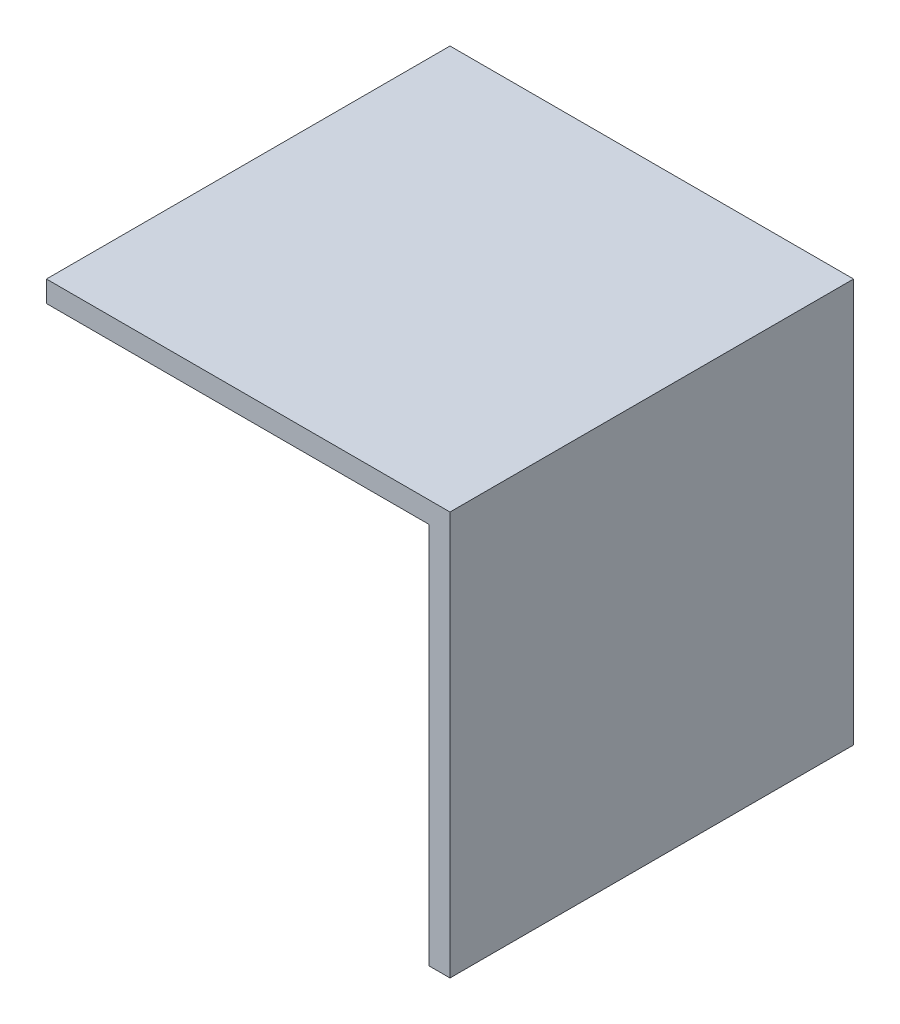
ISO-10303-21;
HEADER;
FILE_DESCRIPTION(('STEP AP214'),'2;1');
FILE_NAME('part.step','',(''),(''),'','','');
FILE_SCHEMA(('AUTOMOTIVE_DESIGN { 1 0 10303 214 1 1 1 1 }'));
ENDSEC;
DATA;
#1=APPLICATION_CONTEXT('core data for automotive mechanical design processes');
#2=APPLICATION_PROTOCOL_DEFINITION('international standard','automotive_design',2000,#1);
#3=PRODUCT_CONTEXT('',#1,'mechanical');
#4=PRODUCT('Part','Part','',(#3));
#5=PRODUCT_RELATED_PRODUCT_CATEGORY('part','',(#4));
#6=PRODUCT_DEFINITION_FORMATION('','',#4);
#7=PRODUCT_DEFINITION_CONTEXT('part definition',#1,'design');
#8=PRODUCT_DEFINITION('design','',#6,#7);
#9=PRODUCT_DEFINITION_SHAPE('','',#8);
#10=(LENGTH_UNIT() NAMED_UNIT(*) SI_UNIT(.MILLI.,.METRE.));
#11=(NAMED_UNIT(*) PLANE_ANGLE_UNIT() SI_UNIT($,.RADIAN.));
#12=(NAMED_UNIT(*) SI_UNIT($,.STERADIAN.) SOLID_ANGLE_UNIT());
#13=UNCERTAINTY_MEASURE_WITH_UNIT(LENGTH_MEASURE(1.E-05),#10,'distance_accuracy_value','');
#14=(GEOMETRIC_REPRESENTATION_CONTEXT(3) GLOBAL_UNCERTAINTY_ASSIGNED_CONTEXT((#13)) GLOBAL_UNIT_ASSIGNED_CONTEXT((#10,
#11,#12)) REPRESENTATION_CONTEXT('',''));
#15=CARTESIAN_POINT('',(0.,0.,0.));
#16=DIRECTION('',(0.,0.,1.));
#17=DIRECTION('',(1.,0.,0.));
#18=AXIS2_PLACEMENT_3D('',#15,#16,#17);
#19=CARTESIAN_POINT('',(0.,0.,5.));
#20=DIRECTION('',(0.,0.,-1.));
#21=DIRECTION('',(-1.,0.,0.));
#22=AXIS2_PLACEMENT_3D('',#19,#20,#21);
#23=PLANE('',#22);
#24=CARTESIAN_POINT('',(0.,19.5,5.));
#25=DIRECTION('',(0.,0.,-1.));
#26=DIRECTION('',(-1.,0.,0.));
#27=AXIS2_PLACEMENT_3D('',#24,#25,#26);
#28=CIRCLE('',#27,13.25);
#29=CARTESIAN_POINT('',(-13.25,19.5,5.));
#30=VERTEX_POINT('',#29);
#31=EDGE_CURVE('E148',#30,#30,#28,.T.);
#32=ORIENTED_EDGE('',*,*,#31,.T.);
#33=EDGE_LOOP('',(#32));
#34=FACE_BOUND('',#33,.T.);
#35=DIRECTION('',(0.,-1.,0.));
#36=VECTOR('',#35,1.);
#37=CARTESIAN_POINT('',(-45.,0.,5.));
#38=LINE('',#37,#36);
#39=CARTESIAN_POINT('',(-45.,45.,5.));
#40=VERTEX_POINT('',#39);
#41=CARTESIAN_POINT('',(-45.,-45.,5.));
#42=VERTEX_POINT('',#41);
#43=EDGE_CURVE('E125',#40,#42,#38,.T.);
#44=ORIENTED_EDGE('',*,*,#43,.T.);
#45=DIRECTION('',(1.,0.,0.));
#46=VECTOR('',#45,1.);
#47=CARTESIAN_POINT('',(0.,-45.,5.));
#48=LINE('',#47,#46);
#49=CARTESIAN_POINT('',(45.,-45.,5.));
#50=VERTEX_POINT('',#49);
#51=EDGE_CURVE('E140',#42,#50,#48,.T.);
#52=ORIENTED_EDGE('',*,*,#51,.T.);
#53=DIRECTION('',(0.,-1.,0.));
#54=VECTOR('',#53,1.);
#55=CARTESIAN_POINT('',(45.,45.,5.));
#56=LINE('',#55,#54);
#57=CARTESIAN_POINT('',(45.,45.,5.));
#58=VERTEX_POINT('',#57);
#59=EDGE_CURVE('E156',#58,#50,#56,.T.);
#60=ORIENTED_EDGE('',*,*,#59,.F.);
#61=DIRECTION('',(1.,0.,0.));
#62=VECTOR('',#61,1.);
#63=CARTESIAN_POINT('',(-50.,45.,5.));
#64=LINE('',#63,#62);
#65=EDGE_CURVE('E152',#40,#58,#64,.T.);
#66=ORIENTED_EDGE('',*,*,#65,.F.);
#67=EDGE_LOOP('',(#44,#52,#60,#66));
#68=FACE_BOUND('',#67,.T.);
#69=ADVANCED_FACE('F42',(#34,#68),#23,.F.);
#70=CARTESIAN_POINT('',(50.,-50.,5.));
#71=DIRECTION('',(-1.,0.,0.));
#72=DIRECTION('',(0.,0.,1.));
#73=AXIS2_PLACEMENT_3D('',#70,#71,#72);
#74=PLANE('',#73);
#75=DIRECTION('',(0.,0.,-1.));
#76=VECTOR('',#75,1.);
#77=CARTESIAN_POINT('',(50.,50.,5.));
#78=LINE('',#77,#76);
#79=CARTESIAN_POINT('',(50.,50.,95.));
#80=VERTEX_POINT('',#79);
#81=CARTESIAN_POINT('',(50.,50.,0.));
#82=VERTEX_POINT('',#81);
#83=EDGE_CURVE('E51',#80,#82,#78,.T.);
#84=ORIENTED_EDGE('',*,*,#83,.F.);
#85=DIRECTION('',(0.,1.,0.));
#86=VECTOR('',#85,1.);
#87=CARTESIAN_POINT('',(50.,50.,95.));
#88=LINE('',#87,#86);
#89=CARTESIAN_POINT('',(50.,-45.,95.));
#90=VERTEX_POINT('',#89);
#91=EDGE_CURVE('E102',#90,#80,#88,.T.);
#92=ORIENTED_EDGE('',*,*,#91,.F.);
#93=DIRECTION('',(0.,0.,-1.));
#94=VECTOR('',#93,1.);
#95=CARTESIAN_POINT('',(50.,-45.,100.));
#96=LINE('',#95,#94);
#97=CARTESIAN_POINT('',(50.,-45.,0.));
#98=VERTEX_POINT('',#97);
#99=EDGE_CURVE('E111',#90,#98,#96,.T.);
#100=ORIENTED_EDGE('',*,*,#99,.T.);
#101=DIRECTION('',(0.,1.,0.));
#102=VECTOR('',#101,1.);
#103=CARTESIAN_POINT('',(50.,-50.,0.));
#104=LINE('',#103,#102);
#105=EDGE_CURVE('E163',#98,#82,#104,.T.);
#106=ORIENTED_EDGE('',*,*,#105,.T.);
#107=EDGE_LOOP('',(#84,#92,#100,#106));
#108=FACE_BOUND('',#107,.T.);
#109=ADVANCED_FACE('F44',(#108),#74,.F.);
#110=CARTESIAN_POINT('',(-50.,50.,5.));
#111=DIRECTION('',(0.,-1.,0.));
#112=DIRECTION('',(0.,0.,-1.));
#113=AXIS2_PLACEMENT_3D('',#110,#111,#112);
#114=PLANE('',#113);
#115=DIRECTION('',(0.,0.,-1.));
#116=VECTOR('',#115,1.);
#117=CARTESIAN_POINT('',(-45.,50.,100.));
#118=LINE('',#117,#116);
#119=CARTESIAN_POINT('',(-45.,50.,95.));
#120=VERTEX_POINT('',#119);
#121=CARTESIAN_POINT('',(-45.,50.,0.));
#122=VERTEX_POINT('',#121);
#123=EDGE_CURVE('E127',#120,#122,#118,.T.);
#124=ORIENTED_EDGE('',*,*,#123,.F.);
#125=DIRECTION('',(1.,0.,0.));
#126=VECTOR('',#125,1.);
#127=CARTESIAN_POINT('',(-45.,50.,95.));
#128=LINE('',#127,#126);
#129=EDGE_CURVE('E58',#120,#80,#128,.T.);
#130=ORIENTED_EDGE('',*,*,#129,.T.);
#131=ORIENTED_EDGE('',*,*,#83,.T.);
#132=DIRECTION('',(-1.,0.,0.));
#133=VECTOR('',#132,1.);
#134=CARTESIAN_POINT('',(-50.,50.,0.));
#135=LINE('',#134,#133);
#136=EDGE_CURVE('E166',#82,#122,#135,.T.);
#137=ORIENTED_EDGE('',*,*,#136,.T.);
#138=EDGE_LOOP('',(#124,#130,#131,#137));
#139=FACE_BOUND('',#138,.T.);
#140=ADVANCED_FACE('F171',(#139),#114,.F.);
#141=CARTESIAN_POINT('',(0.,0.,0.));
#142=DIRECTION('',(0.,0.,-1.));
#143=DIRECTION('',(-1.,0.,0.));
#144=AXIS2_PLACEMENT_3D('',#141,#142,#143);
#145=PLANE('',#144);
#146=DIRECTION('',(1.,0.,0.));
#147=VECTOR('',#146,1.);
#148=CARTESIAN_POINT('',(50.,-45.,0.));
#149=LINE('',#148,#147);
#150=CARTESIAN_POINT('',(-45.,-45.,0.));
#151=VERTEX_POINT('',#150);
#152=EDGE_CURVE('E117',#151,#98,#149,.T.);
#153=ORIENTED_EDGE('',*,*,#152,.F.);
#154=DIRECTION('',(0.,-1.,0.));
#155=VECTOR('',#154,1.);
#156=CARTESIAN_POINT('',(-45.,-45.,0.));
#157=LINE('',#156,#155);
#158=EDGE_CURVE('E177',#122,#151,#157,.T.);
#159=ORIENTED_EDGE('',*,*,#158,.F.);
#160=ORIENTED_EDGE('',*,*,#136,.F.);
#161=ORIENTED_EDGE('',*,*,#105,.F.);
#162=EDGE_LOOP('',(#153,#159,#160,#161));
#163=FACE_BOUND('',#162,.T.);
#164=CARTESIAN_POINT('',(0.,19.5,0.));
#165=DIRECTION('',(0.,0.,-1.));
#166=DIRECTION('',(-1.,0.,0.));
#167=AXIS2_PLACEMENT_3D('',#164,#165,#166);
#168=CIRCLE('',#167,13.25);
#169=CARTESIAN_POINT('',(-13.25,19.5,0.));
#170=VERTEX_POINT('',#169);
#171=EDGE_CURVE('E144',#170,#170,#168,.T.);
#172=ORIENTED_EDGE('',*,*,#171,.F.);
#173=EDGE_LOOP('',(#172));
#174=FACE_BOUND('',#173,.T.);
#175=ADVANCED_FACE('F174',(#163,#174),#145,.T.);
#176=CARTESIAN_POINT('',(-50.,45.,100.));
#177=DIRECTION('',(0.,1.,0.));
#178=DIRECTION('',(0.,0.,1.));
#179=AXIS2_PLACEMENT_3D('',#176,#177,#178);
#180=PLANE('',#179);
#181=DIRECTION('',(0.,0.,-1.));
#182=VECTOR('',#181,1.);
#183=CARTESIAN_POINT('',(45.,45.,100.));
#184=LINE('',#183,#182);
#185=CARTESIAN_POINT('',(45.,45.,95.));
#186=VERTEX_POINT('',#185);
#187=EDGE_CURVE('E160',#186,#58,#184,.T.);
#188=ORIENTED_EDGE('',*,*,#187,.F.);
#189=DIRECTION('',(-1.,0.,0.));
#190=VECTOR('',#189,1.);
#191=CARTESIAN_POINT('',(-50.,45.,95.));
#192=LINE('',#191,#190);
#193=CARTESIAN_POINT('',(-45.,45.,95.));
#194=VERTEX_POINT('',#193);
#195=EDGE_CURVE('E181',#186,#194,#192,.T.);
#196=ORIENTED_EDGE('',*,*,#195,.T.);
#197=DIRECTION('',(0.,0.,-1.));
#198=VECTOR('',#197,1.);
#199=CARTESIAN_POINT('',(-45.,45.,100.));
#200=LINE('',#199,#198);
#201=EDGE_CURVE('E120',#194,#40,#200,.T.);
#202=ORIENTED_EDGE('',*,*,#201,.T.);
#203=ORIENTED_EDGE('',*,*,#65,.T.);
#204=EDGE_LOOP('',(#188,#196,#202,#203));
#205=FACE_BOUND('',#204,.T.);
#206=ADVANCED_FACE('F194',(#205),#180,.F.);
#207=CARTESIAN_POINT('',(45.,45.,100.));
#208=DIRECTION('',(1.,0.,0.));
#209=DIRECTION('',(0.,1.,0.));
#210=AXIS2_PLACEMENT_3D('',#207,#208,#209);
#211=PLANE('',#210);
#212=DIRECTION('',(0.,0.,1.));
#213=VECTOR('',#212,1.);
#214=CARTESIAN_POINT('',(45.,-45.,100.));
#215=LINE('',#214,#213);
#216=CARTESIAN_POINT('',(45.,-45.,95.));
#217=VERTEX_POINT('',#216);
#218=EDGE_CURVE('E137',#50,#217,#215,.T.);
#219=ORIENTED_EDGE('',*,*,#218,.T.);
#220=DIRECTION('',(0.,1.,0.));
#221=VECTOR('',#220,1.);
#222=CARTESIAN_POINT('',(45.,45.,95.));
#223=LINE('',#222,#221);
#224=EDGE_CURVE('E104',#217,#186,#223,.T.);
#225=ORIENTED_EDGE('',*,*,#224,.T.);
#226=ORIENTED_EDGE('',*,*,#187,.T.);
#227=ORIENTED_EDGE('',*,*,#59,.T.);
#228=EDGE_LOOP('',(#219,#225,#226,#227));
#229=FACE_BOUND('',#228,.T.);
#230=ADVANCED_FACE('F192',(#229),#211,.F.);
#231=CARTESIAN_POINT('',(0.,19.5,95.));
#232=DIRECTION('',(0.,0.,-1.));
#233=DIRECTION('',(-1.,0.,0.));
#234=AXIS2_PLACEMENT_3D('',#231,#232,#233);
#235=CYLINDRICAL_SURFACE('',#234,13.25);
#236=ORIENTED_EDGE('',*,*,#171,.T.);
#237=EDGE_LOOP('',(#236));
#238=FACE_BOUND('',#237,.T.);
#239=ORIENTED_EDGE('',*,*,#31,.F.);
#240=EDGE_LOOP('',(#239));
#241=FACE_BOUND('',#240,.T.);
#242=ADVANCED_FACE('F208',(#238,#241),#235,.F.);
#243=CARTESIAN_POINT('',(50.,-45.,100.));
#244=DIRECTION('',(0.,1.,0.));
#245=DIRECTION('',(0.,0.,1.));
#246=AXIS2_PLACEMENT_3D('',#243,#244,#245);
#247=PLANE('',#246);
#248=ORIENTED_EDGE('',*,*,#99,.F.);
#249=DIRECTION('',(1.,0.,0.));
#250=VECTOR('',#249,1.);
#251=CARTESIAN_POINT('',(-45.,-45.,95.));
#252=LINE('',#251,#250);
#253=EDGE_CURVE('E99',#217,#90,#252,.T.);
#254=ORIENTED_EDGE('',*,*,#253,.F.);
#255=ORIENTED_EDGE('',*,*,#218,.F.);
#256=ORIENTED_EDGE('',*,*,#51,.F.);
#257=DIRECTION('',(0.,0.,-1.));
#258=VECTOR('',#257,1.);
#259=CARTESIAN_POINT('',(-45.,-45.,100.));
#260=LINE('',#259,#258);
#261=EDGE_CURVE('E121',#42,#151,#260,.T.);
#262=ORIENTED_EDGE('',*,*,#261,.T.);
#263=ORIENTED_EDGE('',*,*,#152,.T.);
#264=EDGE_LOOP('',(#248,#254,#255,#256,#262,#263));
#265=FACE_BOUND('',#264,.T.);
#266=ADVANCED_FACE('F115',(#265),#247,.F.);
#267=CARTESIAN_POINT('',(-45.,-45.,100.));
#268=DIRECTION('',(1.,0.,0.));
#269=DIRECTION('',(0.,0.,-1.));
#270=AXIS2_PLACEMENT_3D('',#267,#268,#269);
#271=PLANE('',#270);
#272=ORIENTED_EDGE('',*,*,#201,.F.);
#273=DIRECTION('',(0.,1.,0.));
#274=VECTOR('',#273,1.);
#275=CARTESIAN_POINT('',(-45.,-45.,95.));
#276=LINE('',#275,#274);
#277=EDGE_CURVE('E11',#194,#120,#276,.T.);
#278=ORIENTED_EDGE('',*,*,#277,.T.);
#279=ORIENTED_EDGE('',*,*,#123,.T.);
#280=ORIENTED_EDGE('',*,*,#158,.T.);
#281=ORIENTED_EDGE('',*,*,#261,.F.);
#282=ORIENTED_EDGE('',*,*,#43,.F.);
#283=EDGE_LOOP('',(#272,#278,#279,#280,#281,#282));
#284=FACE_BOUND('',#283,.T.);
#285=ADVANCED_FACE('F200',(#284),#271,.F.);
#286=CARTESIAN_POINT('',(-45.,50.,95.));
#287=DIRECTION('',(0.,0.,-1.));
#288=DIRECTION('',(0.,1.,0.));
#289=AXIS2_PLACEMENT_3D('',#286,#287,#288);
#290=PLANE('',#289);
#291=ORIENTED_EDGE('',*,*,#224,.F.);
#292=ORIENTED_EDGE('',*,*,#253,.T.);
#293=ORIENTED_EDGE('',*,*,#91,.T.);
#294=ORIENTED_EDGE('',*,*,#129,.F.);
#295=ORIENTED_EDGE('',*,*,#277,.F.);
#296=ORIENTED_EDGE('',*,*,#195,.F.);
#297=EDGE_LOOP('',(#291,#292,#293,#294,#295,#296));
#298=FACE_BOUND('',#297,.T.);
#299=ADVANCED_FACE('F101',(#298),#290,.F.);
#300=CLOSED_SHELL('',(#69,#109,#140,#175,#206,#230,#242,#266,#285,#299));
#301=MANIFOLD_SOLID_BREP('B2',#300);
#302=ADVANCED_BREP_SHAPE_REPRESENTATION('',(#18,#301),#14);
#303=SHAPE_DEFINITION_REPRESENTATION(#9,#302);
ENDSEC;
END-ISO-10303-21;
